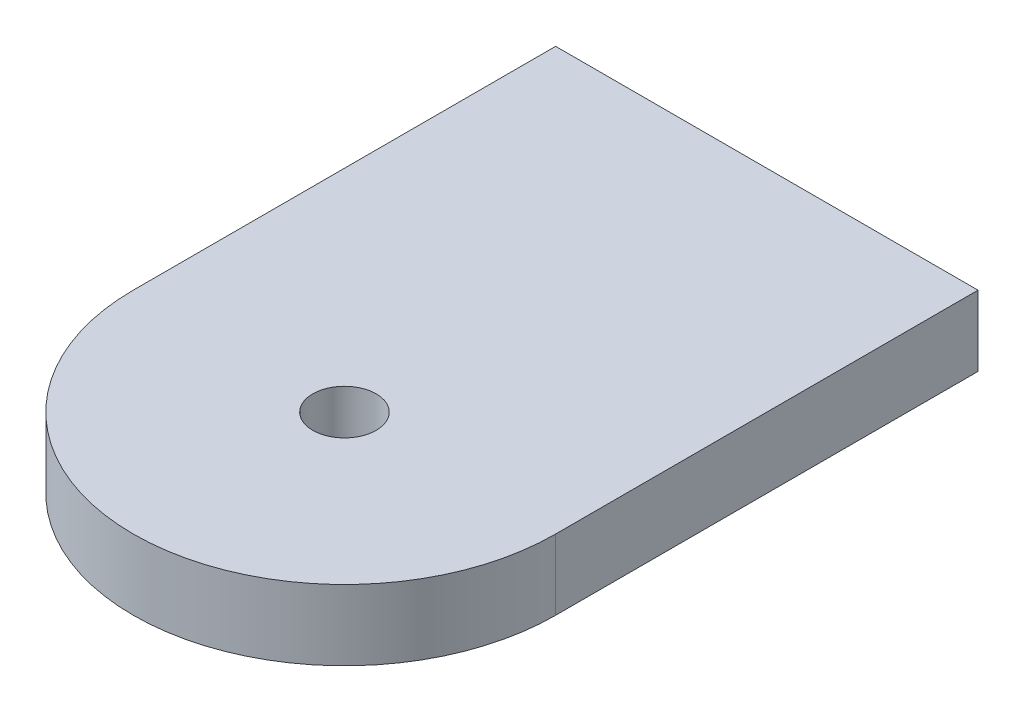
ISO-10303-21;
HEADER;
FILE_DESCRIPTION(('STEP AP214'),'2;1');
FILE_NAME('part.step','',(''),(''),'','','');
FILE_SCHEMA(('AUTOMOTIVE_DESIGN { 1 0 10303 214 1 1 1 1 }'));
ENDSEC;
DATA;
#1=APPLICATION_CONTEXT('core data for automotive mechanical design processes');
#2=APPLICATION_PROTOCOL_DEFINITION('international standard','automotive_design',2000,#1);
#3=PRODUCT_CONTEXT('',#1,'mechanical');
#4=PRODUCT('Part','Part','',(#3));
#5=PRODUCT_RELATED_PRODUCT_CATEGORY('part','',(#4));
#6=PRODUCT_DEFINITION_FORMATION('','',#4);
#7=PRODUCT_DEFINITION_CONTEXT('part definition',#1,'design');
#8=PRODUCT_DEFINITION('design','',#6,#7);
#9=PRODUCT_DEFINITION_SHAPE('','',#8);
#10=(LENGTH_UNIT() NAMED_UNIT(*) SI_UNIT(.MILLI.,.METRE.));
#11=(NAMED_UNIT(*) PLANE_ANGLE_UNIT() SI_UNIT($,.RADIAN.));
#12=(NAMED_UNIT(*) SI_UNIT($,.STERADIAN.) SOLID_ANGLE_UNIT());
#13=UNCERTAINTY_MEASURE_WITH_UNIT(LENGTH_MEASURE(1.E-05),#10,'distance_accuracy_value','');
#14=(GEOMETRIC_REPRESENTATION_CONTEXT(3) GLOBAL_UNCERTAINTY_ASSIGNED_CONTEXT((#13)) GLOBAL_UNIT_ASSIGNED_CONTEXT((#10,
#11,#12)) REPRESENTATION_CONTEXT('',''));
#15=CARTESIAN_POINT('',(0.,0.,0.));
#16=DIRECTION('',(0.,0.,1.));
#17=DIRECTION('',(1.,0.,0.));
#18=AXIS2_PLACEMENT_3D('',#15,#16,#17);
#19=CARTESIAN_POINT('',(3.,1.,6.));
#20=DIRECTION('',(0.,1.,0.));
#21=DIRECTION('',(0.,0.,1.));
#22=AXIS2_PLACEMENT_3D('',#19,#20,#21);
#23=PLANE('',#22);
#24=DIRECTION('',(0.,0.,1.));
#25=VECTOR('',#24,1.);
#26=CARTESIAN_POINT('',(0.,1.,0.));
#27=LINE('',#26,#25);
#28=CARTESIAN_POINT('',(0.,1.,0.));
#29=VERTEX_POINT('',#28);
#30=CARTESIAN_POINT('',(0.,1.,6.));
#31=VERTEX_POINT('',#30);
#32=EDGE_CURVE('E104',#29,#31,#27,.T.);
#33=ORIENTED_EDGE('',*,*,#32,.T.);
#34=CARTESIAN_POINT('',(3.,1.,6.));
#35=DIRECTION('',(0.,1.,0.));
#36=DIRECTION('',(0.,0.,1.));
#37=AXIS2_PLACEMENT_3D('',#34,#35,#36);
#38=CIRCLE('',#37,3.);
#39=CARTESIAN_POINT('',(6.,1.,6.));
#40=VERTEX_POINT('',#39);
#41=EDGE_CURVE('E96',#31,#40,#38,.T.);
#42=ORIENTED_EDGE('',*,*,#41,.T.);
#43=DIRECTION('',(0.,0.,1.));
#44=VECTOR('',#43,1.);
#45=CARTESIAN_POINT('',(6.,1.,0.));
#46=LINE('',#45,#44);
#47=CARTESIAN_POINT('',(6.,1.,0.));
#48=VERTEX_POINT('',#47);
#49=EDGE_CURVE('E103',#48,#40,#46,.T.);
#50=ORIENTED_EDGE('',*,*,#49,.F.);
#51=DIRECTION('',(1.,0.,0.));
#52=VECTOR('',#51,1.);
#53=CARTESIAN_POINT('',(0.,1.,0.));
#54=LINE('',#53,#52);
#55=EDGE_CURVE('E113',#29,#48,#54,.T.);
#56=ORIENTED_EDGE('',*,*,#55,.F.);
#57=EDGE_LOOP('',(#33,#42,#50,#56));
#58=FACE_BOUND('',#57,.T.);
#59=CARTESIAN_POINT('',(3.,1.,6.));
#60=DIRECTION('',(0.,1.,0.));
#61=DIRECTION('',(0.,0.,1.));
#62=AXIS2_PLACEMENT_3D('',#59,#60,#61);
#63=CIRCLE('',#62,0.45);
#64=CARTESIAN_POINT('',(3.,1.,6.45));
#65=VERTEX_POINT('',#64);
#66=EDGE_CURVE('E120',#65,#65,#63,.T.);
#67=ORIENTED_EDGE('',*,*,#66,.F.);
#68=EDGE_LOOP('',(#67));
#69=FACE_BOUND('',#68,.T.);
#70=ADVANCED_FACE('F54',(#58,#69),#23,.T.);
#71=CARTESIAN_POINT('',(3.,0.,6.));
#72=DIRECTION('',(0.,1.,0.));
#73=DIRECTION('',(0.,0.,1.));
#74=AXIS2_PLACEMENT_3D('',#71,#72,#73);
#75=PLANE('',#74);
#76=DIRECTION('',(0.,0.,1.));
#77=VECTOR('',#76,1.);
#78=CARTESIAN_POINT('',(0.,0.,0.));
#79=LINE('',#78,#77);
#80=CARTESIAN_POINT('',(0.,0.,0.));
#81=VERTEX_POINT('',#80);
#82=CARTESIAN_POINT('',(0.,0.,6.));
#83=VERTEX_POINT('',#82);
#84=EDGE_CURVE('E118',#81,#83,#79,.T.);
#85=ORIENTED_EDGE('',*,*,#84,.F.);
#86=DIRECTION('',(1.,0.,0.));
#87=VECTOR('',#86,1.);
#88=CARTESIAN_POINT('',(0.,0.,0.));
#89=LINE('',#88,#87);
#90=CARTESIAN_POINT('',(6.,0.,0.));
#91=VERTEX_POINT('',#90);
#92=EDGE_CURVE('E124',#81,#91,#89,.T.);
#93=ORIENTED_EDGE('',*,*,#92,.T.);
#94=DIRECTION('',(0.,0.,1.));
#95=VECTOR('',#94,1.);
#96=CARTESIAN_POINT('',(6.,0.,0.));
#97=LINE('',#96,#95);
#98=CARTESIAN_POINT('',(6.,0.,6.));
#99=VERTEX_POINT('',#98);
#100=EDGE_CURVE('E122',#91,#99,#97,.T.);
#101=ORIENTED_EDGE('',*,*,#100,.T.);
#102=CARTESIAN_POINT('',(3.,0.,6.));
#103=DIRECTION('',(0.,1.,0.));
#104=DIRECTION('',(0.,0.,1.));
#105=AXIS2_PLACEMENT_3D('',#102,#103,#104);
#106=CIRCLE('',#105,3.);
#107=EDGE_CURVE('E109',#83,#99,#106,.T.);
#108=ORIENTED_EDGE('',*,*,#107,.F.);
#109=EDGE_LOOP('',(#85,#93,#101,#108));
#110=FACE_BOUND('',#109,.T.);
#111=CARTESIAN_POINT('',(3.,0.,6.));
#112=DIRECTION('',(0.,1.,0.));
#113=DIRECTION('',(0.,0.,1.));
#114=AXIS2_PLACEMENT_3D('',#111,#112,#113);
#115=CIRCLE('',#114,0.45);
#116=CARTESIAN_POINT('',(3.,0.,6.45));
#117=VERTEX_POINT('',#116);
#118=EDGE_CURVE('E130',#117,#117,#115,.T.);
#119=ORIENTED_EDGE('',*,*,#118,.T.);
#120=EDGE_LOOP('',(#119));
#121=FACE_BOUND('',#120,.T.);
#122=ADVANCED_FACE('F139',(#110,#121),#75,.F.);
#123=CARTESIAN_POINT('',(0.,1.,0.));
#124=DIRECTION('',(1.,0.,0.));
#125=DIRECTION('',(0.,0.,-1.));
#126=AXIS2_PLACEMENT_3D('',#123,#124,#125);
#127=PLANE('',#126);
#128=ORIENTED_EDGE('',*,*,#84,.T.);
#129=DIRECTION('',(0.,-1.,0.));
#130=VECTOR('',#129,1.);
#131=CARTESIAN_POINT('',(0.,1.,6.));
#132=LINE('',#131,#130);
#133=EDGE_CURVE('E12',#31,#83,#132,.T.);
#134=ORIENTED_EDGE('',*,*,#133,.F.);
#135=ORIENTED_EDGE('',*,*,#32,.F.);
#136=DIRECTION('',(0.,-1.,0.));
#137=VECTOR('',#136,1.);
#138=CARTESIAN_POINT('',(0.,1.,0.));
#139=LINE('',#138,#137);
#140=EDGE_CURVE('E71',#29,#81,#139,.T.);
#141=ORIENTED_EDGE('',*,*,#140,.T.);
#142=EDGE_LOOP('',(#128,#134,#135,#141));
#143=FACE_BOUND('',#142,.T.);
#144=ADVANCED_FACE('F56',(#143),#127,.F.);
#145=CARTESIAN_POINT('',(3.,1.,6.));
#146=DIRECTION('',(0.,-1.,0.));
#147=DIRECTION('',(0.,0.,-1.));
#148=AXIS2_PLACEMENT_3D('',#145,#146,#147);
#149=CYLINDRICAL_SURFACE('',#148,3.);
#150=ORIENTED_EDGE('',*,*,#107,.T.);
#151=DIRECTION('',(0.,-1.,0.));
#152=VECTOR('',#151,1.);
#153=CARTESIAN_POINT('',(6.,1.,6.));
#154=LINE('',#153,#152);
#155=EDGE_CURVE('E63',#40,#99,#154,.T.);
#156=ORIENTED_EDGE('',*,*,#155,.F.);
#157=ORIENTED_EDGE('',*,*,#41,.F.);
#158=ORIENTED_EDGE('',*,*,#133,.T.);
#159=EDGE_LOOP('',(#150,#156,#157,#158));
#160=FACE_BOUND('',#159,.T.);
#161=ADVANCED_FACE('F108',(#160),#149,.T.);
#162=CARTESIAN_POINT('',(6.,1.,0.));
#163=DIRECTION('',(1.,0.,0.));
#164=DIRECTION('',(0.,0.,-1.));
#165=AXIS2_PLACEMENT_3D('',#162,#163,#164);
#166=PLANE('',#165);
#167=ORIENTED_EDGE('',*,*,#100,.F.);
#168=DIRECTION('',(0.,-1.,0.));
#169=VECTOR('',#168,1.);
#170=CARTESIAN_POINT('',(6.,1.,0.));
#171=LINE('',#170,#169);
#172=EDGE_CURVE('E85',#48,#91,#171,.T.);
#173=ORIENTED_EDGE('',*,*,#172,.F.);
#174=ORIENTED_EDGE('',*,*,#49,.T.);
#175=ORIENTED_EDGE('',*,*,#155,.T.);
#176=EDGE_LOOP('',(#167,#173,#174,#175));
#177=FACE_BOUND('',#176,.T.);
#178=ADVANCED_FACE('F112',(#177),#166,.T.);
#179=CARTESIAN_POINT('',(0.,1.,0.));
#180=DIRECTION('',(0.,0.,-1.));
#181=DIRECTION('',(-1.,0.,0.));
#182=AXIS2_PLACEMENT_3D('',#179,#180,#181);
#183=PLANE('',#182);
#184=ORIENTED_EDGE('',*,*,#92,.F.);
#185=ORIENTED_EDGE('',*,*,#140,.F.);
#186=ORIENTED_EDGE('',*,*,#55,.T.);
#187=ORIENTED_EDGE('',*,*,#172,.T.);
#188=EDGE_LOOP('',(#184,#185,#186,#187));
#189=FACE_BOUND('',#188,.T.);
#190=ADVANCED_FACE('F147',(#189),#183,.T.);
#191=CARTESIAN_POINT('',(3.,1.,6.));
#192=DIRECTION('',(0.,-1.,0.));
#193=DIRECTION('',(0.,0.,-1.));
#194=AXIS2_PLACEMENT_3D('',#191,#192,#193);
#195=CYLINDRICAL_SURFACE('',#194,0.45);
#196=ORIENTED_EDGE('',*,*,#66,.T.);
#197=EDGE_LOOP('',(#196));
#198=FACE_BOUND('',#197,.T.);
#199=ORIENTED_EDGE('',*,*,#118,.F.);
#200=EDGE_LOOP('',(#199));
#201=FACE_BOUND('',#200,.T.);
#202=ADVANCED_FACE('F136',(#198,#201),#195,.F.);
#203=CLOSED_SHELL('',(#70,#122,#144,#161,#178,#190,#202));
#204=MANIFOLD_SOLID_BREP('B2',#203);
#205=ADVANCED_BREP_SHAPE_REPRESENTATION('',(#18,#204),#14);
#206=SHAPE_DEFINITION_REPRESENTATION(#9,#205);
ENDSEC;
END-ISO-10303-21;
